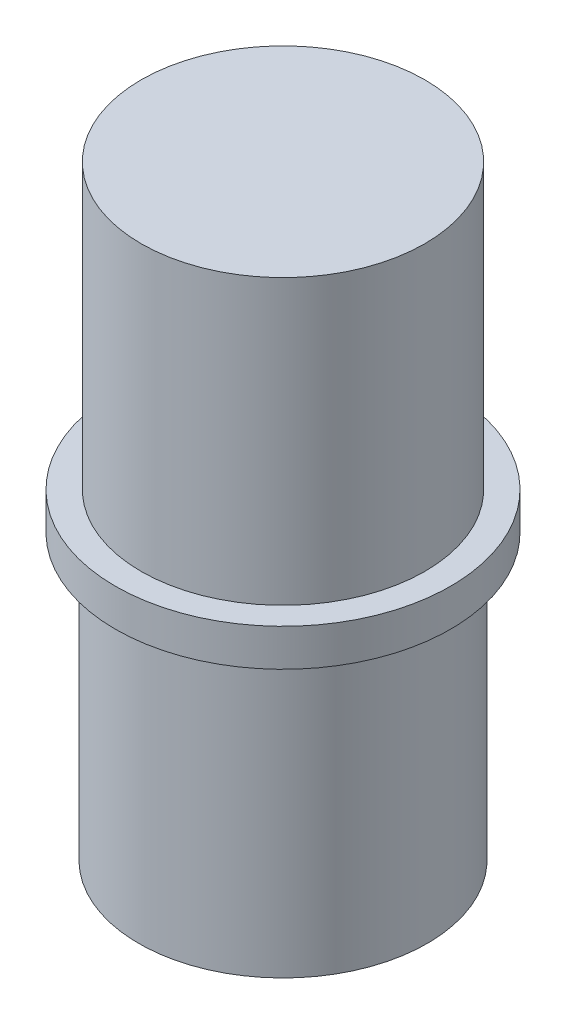
ISO-10303-21;
HEADER;
FILE_DESCRIPTION(('STEP AP214'),'2;1');
FILE_NAME('part.step','',(''),(''),'','','');
FILE_SCHEMA(('AUTOMOTIVE_DESIGN { 1 0 10303 214 1 1 1 1 }'));
ENDSEC;
DATA;
#1=APPLICATION_CONTEXT('core data for automotive mechanical design processes');
#2=APPLICATION_PROTOCOL_DEFINITION('international standard','automotive_design',2000,#1);
#3=PRODUCT_CONTEXT('',#1,'mechanical');
#4=PRODUCT('Part','Part','',(#3));
#5=PRODUCT_RELATED_PRODUCT_CATEGORY('part','',(#4));
#6=PRODUCT_DEFINITION_FORMATION('','',#4);
#7=PRODUCT_DEFINITION_CONTEXT('part definition',#1,'design');
#8=PRODUCT_DEFINITION('design','',#6,#7);
#9=PRODUCT_DEFINITION_SHAPE('','',#8);
#10=(LENGTH_UNIT() NAMED_UNIT(*) SI_UNIT(.MILLI.,.METRE.));
#11=(NAMED_UNIT(*) PLANE_ANGLE_UNIT() SI_UNIT($,.RADIAN.));
#12=(NAMED_UNIT(*) SI_UNIT($,.STERADIAN.) SOLID_ANGLE_UNIT());
#13=UNCERTAINTY_MEASURE_WITH_UNIT(LENGTH_MEASURE(1.E-05),#10,'distance_accuracy_value','');
#14=(GEOMETRIC_REPRESENTATION_CONTEXT(3) GLOBAL_UNCERTAINTY_ASSIGNED_CONTEXT((#13)) GLOBAL_UNIT_ASSIGNED_CONTEXT((#10,
#11,#12)) REPRESENTATION_CONTEXT('',''));
#15=CARTESIAN_POINT('',(0.,0.,0.));
#16=DIRECTION('',(0.,0.,1.));
#17=DIRECTION('',(1.,0.,0.));
#18=AXIS2_PLACEMENT_3D('',#15,#16,#17);
#19=CARTESIAN_POINT('',(0.,7.62,0.));
#20=DIRECTION('',(0.,-1.,0.));
#21=DIRECTION('',(0.,0.,-1.));
#22=AXIS2_PLACEMENT_3D('',#19,#20,#21);
#23=CYLINDRICAL_SURFACE('',#22,3.8735);
#24=CARTESIAN_POINT('',(0.,7.62,0.));
#25=DIRECTION('',(0.,1.,0.));
#26=DIRECTION('',(0.,0.,1.));
#27=AXIS2_PLACEMENT_3D('',#24,#25,#26);
#28=CIRCLE('',#27,3.8735);
#29=CARTESIAN_POINT('',(0.,7.62,-3.8735));
#30=VERTEX_POINT('',#29);
#31=EDGE_CURVE('E38',#30,#30,#28,.T.);
#32=CARTESIAN_POINT('',(0.,0.,0.));
#33=DIRECTION('',(0.,1.,0.));
#34=DIRECTION('',(0.,0.,1.));
#35=AXIS2_PLACEMENT_3D('',#32,#33,#34);
#36=CIRCLE('',#35,3.8735);
#37=CARTESIAN_POINT('',(0.,0.,-3.8735));
#38=VERTEX_POINT('',#37);
#39=EDGE_CURVE('E34',#38,#38,#36,.T.);
#40=CARTESIAN_POINT('',(0.,7.62,-3.8735));
#41=CARTESIAN_POINT('',(0.,7.540625,-3.8735));
#42=CARTESIAN_POINT('',(0.,7.46125,-3.8735));
#43=CARTESIAN_POINT('',(0.,7.3025,-3.8735));
#44=CARTESIAN_POINT('',(0.,7.223125,-3.8735));
#45=CARTESIAN_POINT('',(0.,7.064375,-3.8735));
#46=CARTESIAN_POINT('',(0.,6.985,-3.8735));
#47=CARTESIAN_POINT('',(0.,6.82625,-3.8735));
#48=CARTESIAN_POINT('',(0.,6.746875,-3.8735));
#49=CARTESIAN_POINT('',(0.,6.588125,-3.8735));
#50=CARTESIAN_POINT('',(0.,6.50875,-3.8735));
#51=CARTESIAN_POINT('',(0.,6.35,-3.8735));
#52=CARTESIAN_POINT('',(0.,6.270625,-3.8735));
#53=CARTESIAN_POINT('',(0.,6.111875,-3.8735));
#54=CARTESIAN_POINT('',(0.,6.0325,-3.8735));
#55=CARTESIAN_POINT('',(0.,5.87375,-3.8735));
#56=CARTESIAN_POINT('',(0.,5.794375,-3.8735));
#57=CARTESIAN_POINT('',(0.,5.635625,-3.8735));
#58=CARTESIAN_POINT('',(0.,5.55625,-3.8735));
#59=CARTESIAN_POINT('',(0.,5.3975,-3.8735));
#60=CARTESIAN_POINT('',(0.,5.318125,-3.8735));
#61=CARTESIAN_POINT('',(0.,5.159375,-3.8735));
#62=CARTESIAN_POINT('',(0.,5.08,-3.8735));
#63=CARTESIAN_POINT('',(0.,4.92125,-3.8735));
#64=CARTESIAN_POINT('',(0.,4.841875,-3.8735));
#65=CARTESIAN_POINT('',(0.,4.683125,-3.8735));
#66=CARTESIAN_POINT('',(0.,4.60375,-3.8735));
#67=CARTESIAN_POINT('',(0.,4.445,-3.8735));
#68=CARTESIAN_POINT('',(0.,4.365625,-3.8735));
#69=CARTESIAN_POINT('',(0.,4.206875,-3.8735));
#70=CARTESIAN_POINT('',(0.,4.1275,-3.8735));
#71=CARTESIAN_POINT('',(0.,3.96875,-3.8735));
#72=CARTESIAN_POINT('',(0.,3.889375,-3.8735));
#73=CARTESIAN_POINT('',(0.,3.730625,-3.8735));
#74=CARTESIAN_POINT('',(0.,3.65125,-3.8735));
#75=CARTESIAN_POINT('',(0.,3.4925,-3.8735));
#76=CARTESIAN_POINT('',(0.,3.413125,-3.8735));
#77=CARTESIAN_POINT('',(0.,3.254375,-3.8735));
#78=CARTESIAN_POINT('',(0.,3.175,-3.8735));
#79=CARTESIAN_POINT('',(0.,3.01625,-3.8735));
#80=CARTESIAN_POINT('',(0.,2.936875,-3.8735));
#81=CARTESIAN_POINT('',(0.,2.778125,-3.8735));
#82=CARTESIAN_POINT('',(0.,2.69875,-3.8735));
#83=CARTESIAN_POINT('',(0.,2.54,-3.8735));
#84=CARTESIAN_POINT('',(0.,2.460625,-3.8735));
#85=CARTESIAN_POINT('',(0.,2.301875,-3.8735));
#86=CARTESIAN_POINT('',(0.,2.2225,-3.8735));
#87=CARTESIAN_POINT('',(0.,2.06375,-3.8735));
#88=CARTESIAN_POINT('',(0.,1.984375,-3.8735));
#89=CARTESIAN_POINT('',(0.,1.825625,-3.8735));
#90=CARTESIAN_POINT('',(0.,1.74625,-3.8735));
#91=CARTESIAN_POINT('',(0.,1.5875,-3.8735));
#92=CARTESIAN_POINT('',(0.,1.508125,-3.8735));
#93=CARTESIAN_POINT('',(0.,1.349375,-3.8735));
#94=CARTESIAN_POINT('',(0.,1.27,-3.8735));
#95=CARTESIAN_POINT('',(0.,1.11125,-3.8735));
#96=CARTESIAN_POINT('',(0.,1.031875,-3.8735));
#97=CARTESIAN_POINT('',(0.,0.873125,-3.8735));
#98=CARTESIAN_POINT('',(0.,0.79375,-3.8735));
#99=CARTESIAN_POINT('',(0.,0.635,-3.8735));
#100=CARTESIAN_POINT('',(0.,0.555625,-3.8735));
#101=CARTESIAN_POINT('',(0.,0.396875,-3.8735));
#102=CARTESIAN_POINT('',(0.,0.3175,-3.8735));
#103=CARTESIAN_POINT('',(0.,0.15875,-3.8735));
#104=CARTESIAN_POINT('',(0.,0.0793749999999999,-3.8735));
#105=CARTESIAN_POINT('',(0.,0.,-3.8735));
#106=B_SPLINE_CURVE_WITH_KNOTS('',3,(#40,#41,#42,#43,#44,#45,#46,#47,#48,#49,#50,#51,#52,#53,
#54,#55,#56,#57,#58,#59,#60,#61,#62,#63,#64,#65,#66,#67,#68,#69,#70,#71,#72,#73,#74,#75,#76,#77,
#78,#79,#80,#81,#82,#83,#84,#85,#86,#87,#88,#89,#90,#91,#92,#93,#94,#95,#96,#97,#98,#99,#100,
#101,#102,#103,#104,#105),.UNSPECIFIED.,.F.,.F.,(4,2,2,2,2,2,2,2,2,2,2,2,2,2,2,2,2,2,2,2,2,2,2,
2,2,2,2,2,2,2,2,2,4),(0.,0.238125,0.47625,0.714375000000001,0.9525,1.190625,1.42875,1.666875,
1.905,2.143125,2.38125,2.619375,2.8575,3.095625,3.33375,3.571875,3.81,4.048125,4.28625,4.524375,
4.7625,5.000625,5.23875,5.476875,5.715,5.953125,6.19125,6.429375,6.6675,6.905625,7.14375,
7.381875,7.62),.UNSPECIFIED.);
#107=EDGE_CURVE('BSEAM31',#30,#38,#106,.T.);
#108=ORIENTED_EDGE('',*,*,#31,.F.);
#109=ORIENTED_EDGE('',*,*,#39,.T.);
#110=ORIENTED_EDGE('',*,*,#107,.T.);
#111=ORIENTED_EDGE('',*,*,#107,.F.);
#112=EDGE_LOOP('',(#108,#110,#109,#111));
#113=FACE_BOUND('',#112,.T.);
#114=ADVANCED_FACE('F31',(#113),#23,.T.);
#115=CARTESIAN_POINT('',(0.,0.,0.));
#116=DIRECTION('',(0.,1.,0.));
#117=DIRECTION('',(0.,0.,1.));
#118=AXIS2_PLACEMENT_3D('',#115,#116,#117);
#119=PLANE('',#118);
#120=ORIENTED_EDGE('',*,*,#39,.F.);
#121=EDGE_LOOP('',(#120));
#122=FACE_BOUND('',#121,.T.);
#123=ADVANCED_FACE('F72',(#122),#119,.F.);
#124=CARTESIAN_POINT('',(0.,8.62,0.));
#125=DIRECTION('',(0.,-1.,0.));
#126=DIRECTION('',(0.,0.,-1.));
#127=AXIS2_PLACEMENT_3D('',#124,#125,#126);
#128=CYLINDRICAL_SURFACE('',#127,4.5);
#129=CARTESIAN_POINT('',(0.,8.62,0.));
#130=DIRECTION('',(0.,1.,0.));
#131=DIRECTION('',(0.,0.,1.));
#132=AXIS2_PLACEMENT_3D('',#129,#130,#131);
#133=CIRCLE('',#132,4.5);
#134=CARTESIAN_POINT('',(0.,8.62,4.5));
#135=VERTEX_POINT('',#134);
#136=EDGE_CURVE('E46',#135,#135,#133,.T.);
#137=ORIENTED_EDGE('',*,*,#136,.F.);
#138=EDGE_LOOP('',(#137));
#139=FACE_BOUND('',#138,.T.);
#140=CARTESIAN_POINT('',(0.,7.62,0.));
#141=DIRECTION('',(0.,1.,0.));
#142=DIRECTION('',(0.,0.,1.));
#143=AXIS2_PLACEMENT_3D('',#140,#141,#142);
#144=CIRCLE('',#143,4.5);
#145=CARTESIAN_POINT('',(0.,7.62,4.5));
#146=VERTEX_POINT('',#145);
#147=EDGE_CURVE('E49',#146,#146,#144,.T.);
#148=ORIENTED_EDGE('',*,*,#147,.T.);
#149=EDGE_LOOP('',(#148));
#150=FACE_BOUND('',#149,.T.);
#151=ADVANCED_FACE('F77',(#139,#150),#128,.T.);
#152=CARTESIAN_POINT('',(0.,8.62,0.));
#153=DIRECTION('',(0.,1.,0.));
#154=DIRECTION('',(0.,0.,1.));
#155=AXIS2_PLACEMENT_3D('',#152,#153,#154);
#156=PLANE('',#155);
#157=CARTESIAN_POINT('',(0.,8.62,0.));
#158=DIRECTION('',(0.,1.,0.));
#159=DIRECTION('',(0.,0.,1.));
#160=AXIS2_PLACEMENT_3D('',#157,#158,#159);
#161=CIRCLE('',#160,3.81);
#162=CARTESIAN_POINT('',(0.,8.62,-3.81));
#163=VERTEX_POINT('',#162);
#164=EDGE_CURVE('E10',#163,#163,#161,.T.);
#165=ORIENTED_EDGE('',*,*,#164,.F.);
#166=EDGE_LOOP('',(#165));
#167=FACE_BOUND('',#166,.T.);
#168=ORIENTED_EDGE('',*,*,#136,.T.);
#169=EDGE_LOOP('',(#168));
#170=FACE_BOUND('',#169,.T.);
#171=ADVANCED_FACE('F67',(#167,#170),#156,.T.);
#172=CARTESIAN_POINT('',(0.,7.62,0.));
#173=DIRECTION('',(0.,1.,0.));
#174=DIRECTION('',(0.,0.,1.));
#175=AXIS2_PLACEMENT_3D('',#172,#173,#174);
#176=PLANE('',#175);
#177=ORIENTED_EDGE('',*,*,#31,.T.);
#178=EDGE_LOOP('',(#177));
#179=FACE_BOUND('',#178,.T.);
#180=ORIENTED_EDGE('',*,*,#147,.F.);
#181=EDGE_LOOP('',(#180));
#182=FACE_BOUND('',#181,.T.);
#183=ADVANCED_FACE('F60',(#179,#182),#176,.F.);
#184=CARTESIAN_POINT('',(0.,16.24,0.));
#185=DIRECTION('',(0.,-1.,0.));
#186=DIRECTION('',(0.,0.,-1.));
#187=AXIS2_PLACEMENT_3D('',#184,#185,#186);
#188=CYLINDRICAL_SURFACE('',#187,3.81);
#189=CARTESIAN_POINT('',(0.,16.24,0.));
#190=DIRECTION('',(0.,1.,0.));
#191=DIRECTION('',(0.,0.,1.));
#192=AXIS2_PLACEMENT_3D('',#189,#190,#191);
#193=CIRCLE('',#192,3.81);
#194=CARTESIAN_POINT('',(0.,16.24,-3.81));
#195=VERTEX_POINT('',#194);
#196=EDGE_CURVE('E45',#195,#195,#193,.T.);
#197=CARTESIAN_POINT('',(0.,16.24,-3.81));
#198=CARTESIAN_POINT('',(0.,16.160625,-3.81));
#199=CARTESIAN_POINT('',(0.,16.08125,-3.81));
#200=CARTESIAN_POINT('',(0.,15.9225,-3.81));
#201=CARTESIAN_POINT('',(0.,15.843125,-3.81));
#202=CARTESIAN_POINT('',(0.,15.684375,-3.81));
#203=CARTESIAN_POINT('',(0.,15.605,-3.81));
#204=CARTESIAN_POINT('',(0.,15.44625,-3.81));
#205=CARTESIAN_POINT('',(0.,15.366875,-3.81));
#206=CARTESIAN_POINT('',(0.,15.208125,-3.81));
#207=CARTESIAN_POINT('',(0.,15.12875,-3.81));
#208=CARTESIAN_POINT('',(0.,14.97,-3.81));
#209=CARTESIAN_POINT('',(0.,14.890625,-3.81));
#210=CARTESIAN_POINT('',(0.,14.731875,-3.81));
#211=CARTESIAN_POINT('',(0.,14.6525,-3.81));
#212=CARTESIAN_POINT('',(0.,14.49375,-3.81));
#213=CARTESIAN_POINT('',(0.,14.414375,-3.81));
#214=CARTESIAN_POINT('',(0.,14.255625,-3.81));
#215=CARTESIAN_POINT('',(0.,14.17625,-3.81));
#216=CARTESIAN_POINT('',(0.,14.0175,-3.81));
#217=CARTESIAN_POINT('',(0.,13.938125,-3.81));
#218=CARTESIAN_POINT('',(0.,13.779375,-3.81));
#219=CARTESIAN_POINT('',(0.,13.7,-3.81));
#220=CARTESIAN_POINT('',(0.,13.54125,-3.81));
#221=CARTESIAN_POINT('',(0.,13.461875,-3.81));
#222=CARTESIAN_POINT('',(0.,13.303125,-3.81));
#223=CARTESIAN_POINT('',(0.,13.22375,-3.81));
#224=CARTESIAN_POINT('',(0.,13.065,-3.81));
#225=CARTESIAN_POINT('',(0.,12.985625,-3.81));
#226=CARTESIAN_POINT('',(0.,12.826875,-3.81));
#227=CARTESIAN_POINT('',(0.,12.7475,-3.81));
#228=CARTESIAN_POINT('',(0.,12.58875,-3.81));
#229=CARTESIAN_POINT('',(0.,12.509375,-3.81));
#230=CARTESIAN_POINT('',(0.,12.350625,-3.81));
#231=CARTESIAN_POINT('',(0.,12.27125,-3.81));
#232=CARTESIAN_POINT('',(0.,12.1125,-3.81));
#233=CARTESIAN_POINT('',(0.,12.033125,-3.81));
#234=CARTESIAN_POINT('',(0.,11.874375,-3.81));
#235=CARTESIAN_POINT('',(0.,11.795,-3.81));
#236=CARTESIAN_POINT('',(0.,11.63625,-3.81));
#237=CARTESIAN_POINT('',(0.,11.556875,-3.81));
#238=CARTESIAN_POINT('',(0.,11.398125,-3.81));
#239=CARTESIAN_POINT('',(0.,11.31875,-3.81));
#240=CARTESIAN_POINT('',(0.,11.16,-3.81));
#241=CARTESIAN_POINT('',(0.,11.080625,-3.81));
#242=CARTESIAN_POINT('',(0.,10.921875,-3.81));
#243=CARTESIAN_POINT('',(0.,10.8425,-3.81));
#244=CARTESIAN_POINT('',(0.,10.68375,-3.81));
#245=CARTESIAN_POINT('',(0.,10.604375,-3.81));
#246=CARTESIAN_POINT('',(0.,10.445625,-3.81));
#247=CARTESIAN_POINT('',(0.,10.36625,-3.81));
#248=CARTESIAN_POINT('',(0.,10.2075,-3.81));
#249=CARTESIAN_POINT('',(0.,10.128125,-3.81));
#250=CARTESIAN_POINT('',(0.,9.969375,-3.81));
#251=CARTESIAN_POINT('',(0.,9.89,-3.81));
#252=CARTESIAN_POINT('',(0.,9.73125,-3.81));
#253=CARTESIAN_POINT('',(0.,9.651875,-3.81));
#254=CARTESIAN_POINT('',(0.,9.493125,-3.81));
#255=CARTESIAN_POINT('',(0.,9.41375,-3.81));
#256=CARTESIAN_POINT('',(0.,9.255,-3.81));
#257=CARTESIAN_POINT('',(0.,9.175625,-3.81));
#258=CARTESIAN_POINT('',(0.,9.016875,-3.81));
#259=CARTESIAN_POINT('',(0.,8.9375,-3.81));
#260=CARTESIAN_POINT('',(0.,8.77875,-3.81));
#261=CARTESIAN_POINT('',(0.,8.699375,-3.81));
#262=CARTESIAN_POINT('',(0.,8.62,-3.81));
#263=B_SPLINE_CURVE_WITH_KNOTS('',3,(#197,#198,#199,#200,#201,#202,#203,#204,#205,#206,#207,
#208,#209,#210,#211,#212,#213,#214,#215,#216,#217,#218,#219,#220,#221,#222,#223,#224,#225,#226,
#227,#228,#229,#230,#231,#232,#233,#234,#235,#236,#237,#238,#239,#240,#241,#242,#243,#244,#245,
#246,#247,#248,#249,#250,#251,#252,#253,#254,#255,#256,#257,#258,#259,#260,#261,#262),
.UNSPECIFIED.,.F.,.F.,(4,2,2,2,2,2,2,2,2,2,2,2,2,2,2,2,2,2,2,2,2,2,2,2,2,2,2,2,2,2,2,2,4),(0.,
0.238125000000002,0.476250000000001,0.714375000000001,0.952500000000002,1.190625,1.42875,
1.666875,1.905,2.143125,2.38125,2.619375,2.8575,3.095625,3.33375,3.571875,3.81,4.048125,4.28625,
4.524375,4.7625,5.000625,5.23875,5.476875,5.715,5.953125,6.19125,6.429375,6.6675,6.905625,
7.14375,7.381875,7.62),.UNSPECIFIED.);
#264=EDGE_CURVE('BSEAM58',#195,#163,#263,.T.);
#265=ORIENTED_EDGE('',*,*,#196,.F.);
#266=ORIENTED_EDGE('',*,*,#164,.T.);
#267=ORIENTED_EDGE('',*,*,#264,.T.);
#268=ORIENTED_EDGE('',*,*,#264,.F.);
#269=EDGE_LOOP('',(#265,#267,#266,#268));
#270=FACE_BOUND('',#269,.T.);
#271=ADVANCED_FACE('F58',(#270),#188,.T.);
#272=CARTESIAN_POINT('',(0.,16.24,0.));
#273=DIRECTION('',(0.,1.,0.));
#274=DIRECTION('',(0.,0.,1.));
#275=AXIS2_PLACEMENT_3D('',#272,#273,#274);
#276=PLANE('',#275);
#277=ORIENTED_EDGE('',*,*,#196,.T.);
#278=EDGE_LOOP('',(#277));
#279=FACE_BOUND('',#278,.T.);
#280=ADVANCED_FACE('F56',(#279),#276,.T.);
#281=CLOSED_SHELL('',(#114,#123,#151,#171,#183,#271,#280));
#282=MANIFOLD_SOLID_BREP('B2',#281);
#283=ADVANCED_BREP_SHAPE_REPRESENTATION('',(#18,#282),#14);
#284=SHAPE_DEFINITION_REPRESENTATION(#9,#283);
ENDSEC;
END-ISO-10303-21;
